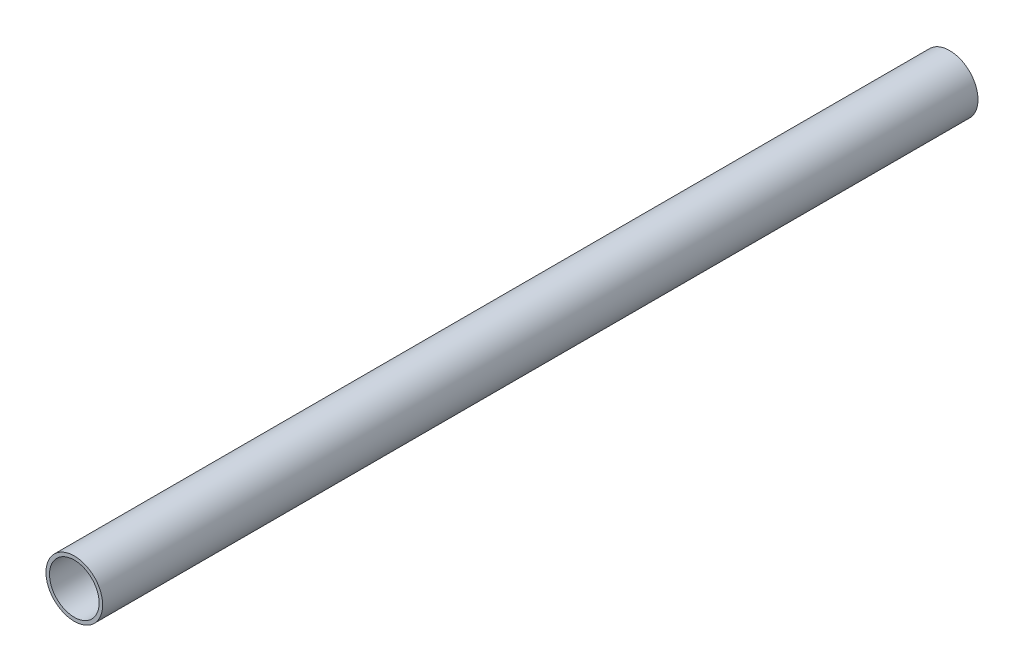
ISO-10303-21;
HEADER;
FILE_DESCRIPTION(('STEP AP214'),'2;1');
FILE_NAME('part.step','',(''),(''),'','','');
FILE_SCHEMA(('AUTOMOTIVE_DESIGN { 1 0 10303 214 1 1 1 1 }'));
ENDSEC;
DATA;
#1=APPLICATION_CONTEXT('core data for automotive mechanical design processes');
#2=APPLICATION_PROTOCOL_DEFINITION('international standard','automotive_design',2000,#1);
#3=PRODUCT_CONTEXT('',#1,'mechanical');
#4=PRODUCT('Part','Part','',(#3));
#5=PRODUCT_RELATED_PRODUCT_CATEGORY('part','',(#4));
#6=PRODUCT_DEFINITION_FORMATION('','',#4);
#7=PRODUCT_DEFINITION_CONTEXT('part definition',#1,'design');
#8=PRODUCT_DEFINITION('design','',#6,#7);
#9=PRODUCT_DEFINITION_SHAPE('','',#8);
#10=(LENGTH_UNIT() NAMED_UNIT(*) SI_UNIT(.MILLI.,.METRE.));
#11=(NAMED_UNIT(*) PLANE_ANGLE_UNIT() SI_UNIT($,.RADIAN.));
#12=(NAMED_UNIT(*) SI_UNIT($,.STERADIAN.) SOLID_ANGLE_UNIT());
#13=UNCERTAINTY_MEASURE_WITH_UNIT(LENGTH_MEASURE(1.E-05),#10,'distance_accuracy_value','');
#14=(GEOMETRIC_REPRESENTATION_CONTEXT(3) GLOBAL_UNCERTAINTY_ASSIGNED_CONTEXT((#13)) GLOBAL_UNIT_ASSIGNED_CONTEXT((#10,
#11,#12)) REPRESENTATION_CONTEXT('',''));
#15=CARTESIAN_POINT('',(0.,0.,0.));
#16=DIRECTION('',(0.,0.,1.));
#17=DIRECTION('',(1.,0.,0.));
#18=AXIS2_PLACEMENT_3D('',#15,#16,#17);
#19=CARTESIAN_POINT('',(0.,0.,247.));
#20=DIRECTION('',(0.,0.,1.));
#21=DIRECTION('',(1.,0.,0.));
#22=AXIS2_PLACEMENT_3D('',#19,#20,#21);
#23=PLANE('',#22);
#24=CARTESIAN_POINT('',(0.,0.,247.));
#25=DIRECTION('',(0.,0.,1.));
#26=DIRECTION('',(1.,0.,0.));
#27=AXIS2_PLACEMENT_3D('',#24,#25,#26);
#28=CIRCLE('',#27,8.);
#29=CARTESIAN_POINT('',(8.,0.,247.));
#30=VERTEX_POINT('',#29);
#31=EDGE_CURVE('E10',#30,#30,#28,.T.);
#32=ORIENTED_EDGE('',*,*,#31,.T.);
#33=EDGE_LOOP('',(#32));
#34=FACE_BOUND('',#33,.T.);
#35=CARTESIAN_POINT('',(0.,0.,247.));
#36=DIRECTION('',(0.,0.,1.));
#37=DIRECTION('',(1.,0.,0.));
#38=AXIS2_PLACEMENT_3D('',#35,#36,#37);
#39=CIRCLE('',#38,7.);
#40=CARTESIAN_POINT('',(7.,0.,247.));
#41=VERTEX_POINT('',#40);
#42=EDGE_CURVE('E50',#41,#41,#39,.T.);
#43=ORIENTED_EDGE('',*,*,#42,.F.);
#44=EDGE_LOOP('',(#43));
#45=FACE_BOUND('',#44,.T.);
#46=ADVANCED_FACE('F37',(#34,#45),#23,.T.);
#47=CARTESIAN_POINT('',(0.,0.,0.));
#48=DIRECTION('',(0.,0.,1.));
#49=DIRECTION('',(1.,0.,0.));
#50=AXIS2_PLACEMENT_3D('',#47,#48,#49);
#51=PLANE('',#50);
#52=CARTESIAN_POINT('',(0.,0.,0.));
#53=DIRECTION('',(0.,0.,1.));
#54=DIRECTION('',(1.,0.,0.));
#55=AXIS2_PLACEMENT_3D('',#52,#53,#54);
#56=CIRCLE('',#55,8.);
#57=CARTESIAN_POINT('',(8.,0.,0.));
#58=VERTEX_POINT('',#57);
#59=EDGE_CURVE('E41',#58,#58,#56,.T.);
#60=ORIENTED_EDGE('',*,*,#59,.F.);
#61=EDGE_LOOP('',(#60));
#62=FACE_BOUND('',#61,.T.);
#63=CARTESIAN_POINT('',(0.,0.,0.));
#64=DIRECTION('',(0.,0.,1.));
#65=DIRECTION('',(1.,0.,0.));
#66=AXIS2_PLACEMENT_3D('',#63,#64,#65);
#67=CIRCLE('',#66,7.);
#68=CARTESIAN_POINT('',(7.,0.,0.));
#69=VERTEX_POINT('',#68);
#70=EDGE_CURVE('E52',#69,#69,#67,.T.);
#71=ORIENTED_EDGE('',*,*,#70,.T.);
#72=EDGE_LOOP('',(#71));
#73=FACE_BOUND('',#72,.T.);
#74=ADVANCED_FACE('F64',(#62,#73),#51,.F.);
#75=CARTESIAN_POINT('',(0.,0.,247.));
#76=DIRECTION('',(0.,0.,-1.));
#77=DIRECTION('',(-1.,0.,0.));
#78=AXIS2_PLACEMENT_3D('',#75,#76,#77);
#79=CYLINDRICAL_SURFACE('',#78,8.);
#80=ORIENTED_EDGE('',*,*,#31,.F.);
#81=EDGE_LOOP('',(#80));
#82=FACE_BOUND('',#81,.T.);
#83=ORIENTED_EDGE('',*,*,#59,.T.);
#84=EDGE_LOOP('',(#83));
#85=FACE_BOUND('',#84,.T.);
#86=ADVANCED_FACE('F39',(#82,#85),#79,.T.);
#87=CARTESIAN_POINT('',(0.,0.,247.));
#88=DIRECTION('',(0.,0.,-1.));
#89=DIRECTION('',(-1.,0.,0.));
#90=AXIS2_PLACEMENT_3D('',#87,#88,#89);
#91=CYLINDRICAL_SURFACE('',#90,7.);
#92=ORIENTED_EDGE('',*,*,#42,.T.);
#93=EDGE_LOOP('',(#92));
#94=FACE_BOUND('',#93,.T.);
#95=ORIENTED_EDGE('',*,*,#70,.F.);
#96=EDGE_LOOP('',(#95));
#97=FACE_BOUND('',#96,.T.);
#98=ADVANCED_FACE('F60',(#94,#97),#91,.F.);
#99=CLOSED_SHELL('',(#46,#74,#86,#98));
#100=MANIFOLD_SOLID_BREP('B2',#99);
#101=ADVANCED_BREP_SHAPE_REPRESENTATION('',(#18,#100),#14);
#102=SHAPE_DEFINITION_REPRESENTATION(#9,#101);
ENDSEC;
END-ISO-10303-21;
